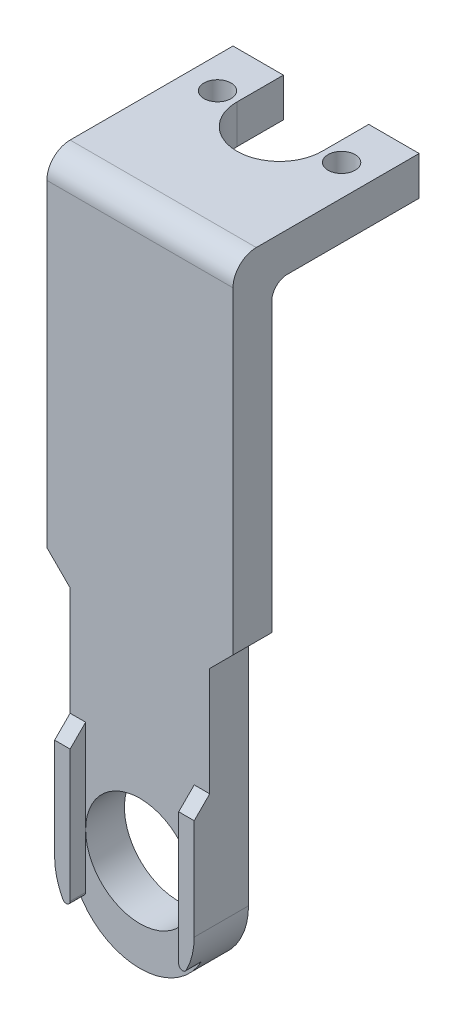
ISO-10303-21;
HEADER;
FILE_DESCRIPTION(('STEP AP214'),'2;1');
FILE_NAME('part.step','',(''),(''),'','','');
FILE_SCHEMA(('AUTOMOTIVE_DESIGN { 1 0 10303 214 1 1 1 1 }'));
ENDSEC;
DATA;
#1=APPLICATION_CONTEXT('core data for automotive mechanical design processes');
#2=APPLICATION_PROTOCOL_DEFINITION('international standard','automotive_design',2000,#1);
#3=PRODUCT_CONTEXT('',#1,'mechanical');
#4=PRODUCT('Part','Part','',(#3));
#5=PRODUCT_RELATED_PRODUCT_CATEGORY('part','',(#4));
#6=PRODUCT_DEFINITION_FORMATION('','',#4);
#7=PRODUCT_DEFINITION_CONTEXT('part definition',#1,'design');
#8=PRODUCT_DEFINITION('design','',#6,#7);
#9=PRODUCT_DEFINITION_SHAPE('','',#8);
#10=(LENGTH_UNIT() NAMED_UNIT(*) SI_UNIT(.MILLI.,.METRE.));
#11=(NAMED_UNIT(*) PLANE_ANGLE_UNIT() SI_UNIT($,.RADIAN.));
#12=(NAMED_UNIT(*) SI_UNIT($,.STERADIAN.) SOLID_ANGLE_UNIT());
#13=UNCERTAINTY_MEASURE_WITH_UNIT(LENGTH_MEASURE(1.E-05),#10,'distance_accuracy_value','');
#14=(GEOMETRIC_REPRESENTATION_CONTEXT(3) GLOBAL_UNCERTAINTY_ASSIGNED_CONTEXT((#13)) GLOBAL_UNIT_ASSIGNED_CONTEXT((#10,
#11,#12)) REPRESENTATION_CONTEXT('',''));
#15=CARTESIAN_POINT('',(0.,0.,0.));
#16=DIRECTION('',(0.,0.,1.));
#17=DIRECTION('',(1.,0.,0.));
#18=AXIS2_PLACEMENT_3D('',#15,#16,#17);
#19=CARTESIAN_POINT('',(-12.,5.,18.));
#20=DIRECTION('',(0.,0.,-1.));
#21=DIRECTION('',(-1.,0.,0.));
#22=AXIS2_PLACEMENT_3D('',#19,#20,#21);
#23=PLANE('',#22);
#24=DIRECTION('',(0.,-1.,0.));
#25=VECTOR('',#24,1.);
#26=CARTESIAN_POINT('',(7.00000000000001,-58.,18.));
#27=LINE('',#26,#25);
#28=CARTESIAN_POINT('',(7.00000000000001,-68.,18.));
#29=VERTEX_POINT('',#28);
#30=CARTESIAN_POINT('',(7.,-75.,18.));
#31=VERTEX_POINT('',#30);
#32=EDGE_CURVE('E257',#29,#31,#27,.T.);
#33=ORIENTED_EDGE('',*,*,#32,.F.);
#34=CARTESIAN_POINT('',(0.,-68.,18.));
#35=DIRECTION('',(0.,0.,1.));
#36=DIRECTION('',(1.,0.,0.));
#37=AXIS2_PLACEMENT_3D('',#34,#35,#36);
#38=CIRCLE('',#37,7.);
#39=CARTESIAN_POINT('',(-6.99999999999999,-68.,18.));
#40=VERTEX_POINT('',#39);
#41=EDGE_CURVE('E346',#40,#29,#38,.T.);
#42=ORIENTED_EDGE('',*,*,#41,.F.);
#43=DIRECTION('',(0.,1.,0.));
#44=VECTOR('',#43,1.);
#45=CARTESIAN_POINT('',(-6.99999999999999,-58.,18.));
#46=LINE('',#45,#44);
#47=CARTESIAN_POINT('',(-6.99999999999999,-75.,18.));
#48=VERTEX_POINT('',#47);
#49=EDGE_CURVE('E263',#48,#40,#46,.T.);
#50=ORIENTED_EDGE('',*,*,#49,.F.);
#51=CARTESIAN_POINT('',(-7.49999999999999,-75.,18.));
#52=DIRECTION('',(0.,0.,-1.));
#53=DIRECTION('',(-1.,0.,0.));
#54=AXIS2_PLACEMENT_3D('',#51,#52,#53);
#55=CIRCLE('',#54,0.5);
#56=CARTESIAN_POINT('',(-7.94117647058823,-75.2352941176471,18.));
#57=VERTEX_POINT('',#56);
#58=EDGE_CURVE('E11',#48,#57,#55,.T.);
#59=ORIENTED_EDGE('',*,*,#58,.T.);
#60=CARTESIAN_POINT('',(0.,-71.,18.));
#61=DIRECTION('',(0.,0.,-1.));
#62=DIRECTION('',(-1.,0.,0.));
#63=AXIS2_PLACEMENT_3D('',#60,#61,#62);
#64=CIRCLE('',#63,9.);
#65=CARTESIAN_POINT('',(0.,-80.,18.));
#66=VERTEX_POINT('',#65);
#67=EDGE_CURVE('E57',#57,#66,#64,.F.);
#68=ORIENTED_EDGE('',*,*,#67,.T.);
#69=CARTESIAN_POINT('',(0.,-71.,18.));
#70=DIRECTION('',(0.,0.,-1.));
#71=DIRECTION('',(-1.,0.,0.));
#72=AXIS2_PLACEMENT_3D('',#69,#70,#71);
#73=CIRCLE('',#72,9.);
#74=CARTESIAN_POINT('',(7.94117647058823,-75.2352941176471,18.));
#75=VERTEX_POINT('',#74);
#76=EDGE_CURVE('E456',#66,#75,#73,.F.);
#77=ORIENTED_EDGE('',*,*,#76,.T.);
#78=CARTESIAN_POINT('',(7.5,-75.,18.));
#79=DIRECTION('',(0.,0.,-1.));
#80=DIRECTION('',(-1.,0.,0.));
#81=AXIS2_PLACEMENT_3D('',#78,#79,#80);
#82=CIRCLE('',#81,0.5);
#83=EDGE_CURVE('E50',#75,#31,#82,.T.);
#84=ORIENTED_EDGE('',*,*,#83,.T.);
#85=EDGE_LOOP('',(#33,#42,#50,#59,#68,#77,#84));
#86=FACE_BOUND('',#85,.T.);
#87=ADVANCED_FACE('F41',(#86),#23,.F.);
#88=CARTESIAN_POINT('',(7.00000000000001,-56.,18.));
#89=VERTEX_POINT('',#88);
#90=EDGE_CURVE('E253',#89,#29,#27,.T.);
#91=ORIENTED_EDGE('',*,*,#90,.F.);
#92=DIRECTION('',(1.,0.,0.));
#93=VECTOR('',#92,1.);
#94=CARTESIAN_POINT('',(8.99999999999999,-56.,18.));
#95=LINE('',#94,#93);
#96=CARTESIAN_POINT('',(8.99999999999999,-56.,18.));
#97=VERTEX_POINT('',#96);
#98=EDGE_CURVE('E468',#89,#97,#95,.T.);
#99=ORIENTED_EDGE('',*,*,#98,.T.);
#100=DIRECTION('',(0.,-1.,0.));
#101=VECTOR('',#100,1.);
#102=CARTESIAN_POINT('',(8.99999999999999,-42.,18.));
#103=LINE('',#102,#101);
#104=CARTESIAN_POINT('',(8.99999999999999,-42.,18.));
#105=VERTEX_POINT('',#104);
#106=EDGE_CURVE('E292',#105,#97,#103,.T.);
#107=ORIENTED_EDGE('',*,*,#106,.F.);
#108=DIRECTION('',(-0.707106781186543,-0.707106781186552,0.));
#109=VECTOR('',#108,1.);
#110=CARTESIAN_POINT('',(12.,-39.,18.));
#111=LINE('',#110,#109);
#112=CARTESIAN_POINT('',(12.,-39.,18.));
#113=VERTEX_POINT('',#112);
#114=EDGE_CURVE('E295',#113,#105,#111,.T.);
#115=ORIENTED_EDGE('',*,*,#114,.F.);
#116=DIRECTION('',(0.,-1.,0.));
#117=VECTOR('',#116,1.);
#118=CARTESIAN_POINT('',(12.,5.,18.));
#119=LINE('',#118,#117);
#120=CARTESIAN_POINT('',(12.,2.,18.));
#121=VERTEX_POINT('',#120);
#122=EDGE_CURVE('E390',#121,#113,#119,.T.);
#123=ORIENTED_EDGE('',*,*,#122,.F.);
#124=DIRECTION('',(1.,0.,0.));
#125=VECTOR('',#124,1.);
#126=CARTESIAN_POINT('',(-12.,2.,18.));
#127=LINE('',#126,#125);
#128=CARTESIAN_POINT('',(-12.,2.,18.));
#129=VERTEX_POINT('',#128);
#130=EDGE_CURVE('E410',#121,#129,#127,.F.);
#131=ORIENTED_EDGE('',*,*,#130,.T.);
#132=DIRECTION('',(0.,-1.,0.));
#133=VECTOR('',#132,1.);
#134=CARTESIAN_POINT('',(-12.,5.,18.));
#135=LINE('',#134,#133);
#136=CARTESIAN_POINT('',(-12.,-39.,18.));
#137=VERTEX_POINT('',#136);
#138=EDGE_CURVE('E399',#129,#137,#135,.T.);
#139=ORIENTED_EDGE('',*,*,#138,.T.);
#140=DIRECTION('',(-0.707106781186544,0.707106781186551,0.));
#141=VECTOR('',#140,1.);
#142=CARTESIAN_POINT('',(-12.,-39.,18.));
#143=LINE('',#142,#141);
#144=CARTESIAN_POINT('',(-9.,-42.,18.));
#145=VERTEX_POINT('',#144);
#146=EDGE_CURVE('E279',#145,#137,#143,.T.);
#147=ORIENTED_EDGE('',*,*,#146,.F.);
#148=DIRECTION('',(0.,1.,0.));
#149=VECTOR('',#148,1.);
#150=CARTESIAN_POINT('',(-9.,-42.,18.));
#151=LINE('',#150,#149);
#152=CARTESIAN_POINT('',(-8.99999999999999,-56.,18.));
#153=VERTEX_POINT('',#152);
#154=EDGE_CURVE('E276',#153,#145,#151,.T.);
#155=ORIENTED_EDGE('',*,*,#154,.F.);
#156=DIRECTION('',(1.,0.,0.));
#157=VECTOR('',#156,1.);
#158=CARTESIAN_POINT('',(-6.99999999999999,-56.,18.));
#159=LINE('',#158,#157);
#160=CARTESIAN_POINT('',(-6.99999999999999,-56.,18.));
#161=VERTEX_POINT('',#160);
#162=EDGE_CURVE('E462',#153,#161,#159,.T.);
#163=ORIENTED_EDGE('',*,*,#162,.T.);
#164=EDGE_CURVE('E249',#40,#161,#46,.T.);
#165=ORIENTED_EDGE('',*,*,#164,.F.);
#166=EDGE_CURVE('E345',#29,#40,#38,.T.);
#167=ORIENTED_EDGE('',*,*,#166,.F.);
#168=EDGE_LOOP('',(#91,#99,#107,#115,#123,#131,#139,#147,#155,#163,#165,#167));
#169=FACE_BOUND('',#168,.T.);
#170=ADVANCED_FACE('F530',(#169),#23,.F.);
#171=CARTESIAN_POINT('',(12.,-80.,-6.));
#172=DIRECTION('',(0.,0.,1.));
#173=DIRECTION('',(1.,0.,0.));
#174=AXIS2_PLACEMENT_3D('',#171,#172,#173);
#175=PLANE('',#174);
#176=DIRECTION('',(1.,0.,0.));
#177=VECTOR('',#176,1.);
#178=CARTESIAN_POINT('',(12.,5.,-6.));
#179=LINE('',#178,#177);
#180=CARTESIAN_POINT('',(-12.,5.,-6.));
#181=VERTEX_POINT('',#180);
#182=CARTESIAN_POINT('',(-5.5,5.,-6.));
#183=VERTEX_POINT('',#182);
#184=EDGE_CURVE('E329',#181,#183,#179,.T.);
#185=ORIENTED_EDGE('',*,*,#184,.T.);
#186=DIRECTION('',(0.,-1.,0.));
#187=VECTOR('',#186,1.);
#188=CARTESIAN_POINT('',(-5.5,-80.,-6.));
#189=LINE('',#188,#187);
#190=CARTESIAN_POINT('',(-5.5,0.,-6.));
#191=VERTEX_POINT('',#190);
#192=EDGE_CURVE('E439',#183,#191,#189,.T.);
#193=ORIENTED_EDGE('',*,*,#192,.T.);
#194=DIRECTION('',(-1.,0.,0.));
#195=VECTOR('',#194,1.);
#196=CARTESIAN_POINT('',(0.,0.,-6.));
#197=LINE('',#196,#195);
#198=CARTESIAN_POINT('',(-12.,0.,-6.));
#199=VERTEX_POINT('',#198);
#200=EDGE_CURVE('E338',#191,#199,#197,.T.);
#201=ORIENTED_EDGE('',*,*,#200,.T.);
#202=DIRECTION('',(0.,1.,0.));
#203=VECTOR('',#202,1.);
#204=CARTESIAN_POINT('',(-12.,-80.,-6.));
#205=LINE('',#204,#203);
#206=EDGE_CURVE('E333',#199,#181,#205,.T.);
#207=ORIENTED_EDGE('',*,*,#206,.T.);
#208=EDGE_LOOP('',(#185,#193,#201,#207));
#209=FACE_BOUND('',#208,.T.);
#210=ADVANCED_FACE('F595',(#209),#175,.F.);
#211=CARTESIAN_POINT('',(0.,5.,0.));
#212=DIRECTION('',(0.,-1.,0.));
#213=DIRECTION('',(0.,0.,-1.));
#214=AXIS2_PLACEMENT_3D('',#211,#212,#213);
#215=PLANE('',#214);
#216=CARTESIAN_POINT('',(0.,5.,0.));
#217=DIRECTION('',(0.,1.,0.));
#218=DIRECTION('',(0.,0.,1.));
#219=AXIS2_PLACEMENT_3D('',#216,#217,#218);
#220=CIRCLE('',#219,5.5);
#221=CARTESIAN_POINT('',(-5.5,5.,0.));
#222=VERTEX_POINT('',#221);
#223=CARTESIAN_POINT('',(5.5,5.,0.));
#224=VERTEX_POINT('',#223);
#225=EDGE_CURVE('E374',#222,#224,#220,.T.);
#226=ORIENTED_EDGE('',*,*,#225,.F.);
#227=DIRECTION('',(0.,0.,1.));
#228=VECTOR('',#227,1.);
#229=CARTESIAN_POINT('',(-5.5,5.,-6.));
#230=LINE('',#229,#228);
#231=EDGE_CURVE('E309',#183,#222,#230,.T.);
#232=ORIENTED_EDGE('',*,*,#231,.F.);
#233=ORIENTED_EDGE('',*,*,#184,.F.);
#234=DIRECTION('',(0.,0.,1.));
#235=VECTOR('',#234,1.);
#236=CARTESIAN_POINT('',(-12.,5.,-8.));
#237=LINE('',#236,#235);
#238=CARTESIAN_POINT('',(-12.,5.,15.));
#239=VERTEX_POINT('',#238);
#240=EDGE_CURVE('E382',#181,#239,#237,.T.);
#241=ORIENTED_EDGE('',*,*,#240,.T.);
#242=DIRECTION('',(1.,0.,0.));
#243=VECTOR('',#242,1.);
#244=CARTESIAN_POINT('',(0.,5.,15.));
#245=LINE('',#244,#243);
#246=CARTESIAN_POINT('',(12.,5.,15.));
#247=VERTEX_POINT('',#246);
#248=EDGE_CURVE('E403',#239,#247,#245,.T.);
#249=ORIENTED_EDGE('',*,*,#248,.T.);
#250=DIRECTION('',(0.,0.,-1.));
#251=VECTOR('',#250,1.);
#252=CARTESIAN_POINT('',(12.,5.,18.));
#253=LINE('',#252,#251);
#254=CARTESIAN_POINT('',(12.,5.,-5.99999999999999));
#255=VERTEX_POINT('',#254);
#256=EDGE_CURVE('E385',#247,#255,#253,.T.);
#257=ORIENTED_EDGE('',*,*,#256,.T.);
#258=CARTESIAN_POINT('',(5.5,5.,-6.));
#259=VERTEX_POINT('',#258);
#260=EDGE_CURVE('E328',#259,#255,#179,.T.);
#261=ORIENTED_EDGE('',*,*,#260,.F.);
#262=DIRECTION('',(0.,0.,-1.));
#263=VECTOR('',#262,1.);
#264=CARTESIAN_POINT('',(5.5,5.,0.));
#265=LINE('',#264,#263);
#266=EDGE_CURVE('E312',#224,#259,#265,.T.);
#267=ORIENTED_EDGE('',*,*,#266,.F.);
#268=EDGE_LOOP('',(#226,#232,#233,#241,#249,#257,#261,#267));
#269=FACE_BOUND('',#268,.T.);
#270=CARTESIAN_POINT('',(-8.,5.,0.));
#271=DIRECTION('',(0.,1.,0.));
#272=DIRECTION('',(0.,0.,1.));
#273=AXIS2_PLACEMENT_3D('',#270,#271,#272);
#274=CIRCLE('',#273,1.75);
#275=CARTESIAN_POINT('',(-8.,5.,1.75));
#276=VERTEX_POINT('',#275);
#277=EDGE_CURVE('E366',#276,#276,#274,.T.);
#278=ORIENTED_EDGE('',*,*,#277,.F.);
#279=EDGE_LOOP('',(#278));
#280=FACE_BOUND('',#279,.T.);
#281=CARTESIAN_POINT('',(8.,5.,0.));
#282=DIRECTION('',(0.,1.,0.));
#283=DIRECTION('',(0.,0.,1.));
#284=AXIS2_PLACEMENT_3D('',#281,#282,#283);
#285=CIRCLE('',#284,1.75);
#286=CARTESIAN_POINT('',(8.,5.,1.75));
#287=VERTEX_POINT('',#286);
#288=EDGE_CURVE('E358',#287,#287,#285,.T.);
#289=ORIENTED_EDGE('',*,*,#288,.F.);
#290=EDGE_LOOP('',(#289));
#291=FACE_BOUND('',#290,.T.);
#292=ADVANCED_FACE('F546',(#269,#280,#291),#215,.F.);
#293=CARTESIAN_POINT('',(0.,0.,0.));
#294=DIRECTION('',(0.,-1.,0.));
#295=DIRECTION('',(0.,0.,-1.));
#296=AXIS2_PLACEMENT_3D('',#293,#294,#295);
#297=PLANE('',#296);
#298=DIRECTION('',(0.,0.,-1.));
#299=VECTOR('',#298,1.);
#300=CARTESIAN_POINT('',(-5.5,0.,0.));
#301=LINE('',#300,#299);
#302=CARTESIAN_POINT('',(-5.5,0.,0.));
#303=VERTEX_POINT('',#302);
#304=EDGE_CURVE('E325',#303,#191,#301,.T.);
#305=ORIENTED_EDGE('',*,*,#304,.F.);
#306=CARTESIAN_POINT('',(0.,0.,0.));
#307=DIRECTION('',(0.,1.,0.));
#308=DIRECTION('',(0.,0.,1.));
#309=AXIS2_PLACEMENT_3D('',#306,#307,#308);
#310=CIRCLE('',#309,5.5);
#311=CARTESIAN_POINT('',(5.5,0.,0.));
#312=VERTEX_POINT('',#311);
#313=EDGE_CURVE('E370',#303,#312,#310,.T.);
#314=ORIENTED_EDGE('',*,*,#313,.T.);
#315=DIRECTION('',(0.,0.,1.));
#316=VECTOR('',#315,1.);
#317=CARTESIAN_POINT('',(5.5,0.,0.));
#318=LINE('',#317,#316);
#319=CARTESIAN_POINT('',(5.5,0.,-6.));
#320=VERTEX_POINT('',#319);
#321=EDGE_CURVE('E319',#320,#312,#318,.T.);
#322=ORIENTED_EDGE('',*,*,#321,.F.);
#323=CARTESIAN_POINT('',(12.,0.,-6.));
#324=VERTEX_POINT('',#323);
#325=EDGE_CURVE('E341',#324,#320,#197,.T.);
#326=ORIENTED_EDGE('',*,*,#325,.F.);
#327=DIRECTION('',(0.,0.,-1.));
#328=VECTOR('',#327,1.);
#329=CARTESIAN_POINT('',(12.,0.,-8.));
#330=LINE('',#329,#328);
#331=CARTESIAN_POINT('',(12.,0.,11.));
#332=VERTEX_POINT('',#331);
#333=EDGE_CURVE('E386',#332,#324,#330,.T.);
#334=ORIENTED_EDGE('',*,*,#333,.F.);
#335=DIRECTION('',(1.,0.,0.));
#336=VECTOR('',#335,1.);
#337=CARTESIAN_POINT('',(0.,0.,11.));
#338=LINE('',#337,#336);
#339=CARTESIAN_POINT('',(-12.,0.,11.));
#340=VERTEX_POINT('',#339);
#341=EDGE_CURVE('E421',#332,#340,#338,.F.);
#342=ORIENTED_EDGE('',*,*,#341,.T.);
#343=DIRECTION('',(0.,0.,1.));
#344=VECTOR('',#343,1.);
#345=CARTESIAN_POINT('',(-12.,0.,-8.));
#346=LINE('',#345,#344);
#347=EDGE_CURVE('E378',#199,#340,#346,.T.);
#348=ORIENTED_EDGE('',*,*,#347,.F.);
#349=ORIENTED_EDGE('',*,*,#200,.F.);
#350=EDGE_LOOP('',(#305,#314,#322,#326,#334,#342,#348,#349));
#351=FACE_BOUND('',#350,.T.);
#352=CARTESIAN_POINT('',(-8.,0.,0.));
#353=DIRECTION('',(0.,1.,0.));
#354=DIRECTION('',(0.,0.,1.));
#355=AXIS2_PLACEMENT_3D('',#352,#353,#354);
#356=CIRCLE('',#355,1.75);
#357=CARTESIAN_POINT('',(-8.,0.,1.75));
#358=VERTEX_POINT('',#357);
#359=EDGE_CURVE('E362',#358,#358,#356,.T.);
#360=ORIENTED_EDGE('',*,*,#359,.T.);
#361=EDGE_LOOP('',(#360));
#362=FACE_BOUND('',#361,.T.);
#363=CARTESIAN_POINT('',(8.,0.,0.));
#364=DIRECTION('',(0.,1.,0.));
#365=DIRECTION('',(0.,0.,1.));
#366=AXIS2_PLACEMENT_3D('',#363,#364,#365);
#367=CIRCLE('',#366,1.75);
#368=CARTESIAN_POINT('',(8.,0.,1.75));
#369=VERTEX_POINT('',#368);
#370=EDGE_CURVE('E357',#369,#369,#367,.T.);
#371=ORIENTED_EDGE('',*,*,#370,.T.);
#372=EDGE_LOOP('',(#371));
#373=FACE_BOUND('',#372,.T.);
#374=ADVANCED_FACE('F559',(#351,#362,#373),#297,.T.);
#375=CARTESIAN_POINT('',(-12.,5.,-8.));
#376=DIRECTION('',(1.,0.,0.));
#377=DIRECTION('',(0.,0.,-1.));
#378=AXIS2_PLACEMENT_3D('',#375,#376,#377);
#379=PLANE('',#378);
#380=DIRECTION('',(0.,1.,0.));
#381=VECTOR('',#380,1.);
#382=CARTESIAN_POINT('',(-12.,-80.,13.));
#383=LINE('',#382,#381);
#384=CARTESIAN_POINT('',(-12.,-39.,13.));
#385=VERTEX_POINT('',#384);
#386=CARTESIAN_POINT('',(-12.,-2.,13.));
#387=VERTEX_POINT('',#386);
#388=EDGE_CURVE('E354',#385,#387,#383,.T.);
#389=ORIENTED_EDGE('',*,*,#388,.F.);
#390=DIRECTION('',(0.,0.,1.));
#391=VECTOR('',#390,1.);
#392=CARTESIAN_POINT('',(-12.,-39.,-6.));
#393=LINE('',#392,#391);
#394=EDGE_CURVE('E284',#385,#137,#393,.T.);
#395=ORIENTED_EDGE('',*,*,#394,.T.);
#396=ORIENTED_EDGE('',*,*,#138,.F.);
#397=CARTESIAN_POINT('',(-12.,2.,15.));
#398=DIRECTION('',(1.,0.,0.));
#399=DIRECTION('',(0.,0.,-1.));
#400=AXIS2_PLACEMENT_3D('',#397,#398,#399);
#401=CIRCLE('',#400,3.);
#402=EDGE_CURVE('E413',#129,#239,#401,.F.);
#403=ORIENTED_EDGE('',*,*,#402,.T.);
#404=ORIENTED_EDGE('',*,*,#240,.F.);
#405=ORIENTED_EDGE('',*,*,#206,.F.);
#406=ORIENTED_EDGE('',*,*,#347,.T.);
#407=CARTESIAN_POINT('',(-12.,-2.,11.));
#408=DIRECTION('',(1.,0.,0.));
#409=DIRECTION('',(0.,0.,-1.));
#410=AXIS2_PLACEMENT_3D('',#407,#408,#409);
#411=CIRCLE('',#410,2.);
#412=EDGE_CURVE('E428',#340,#387,#411,.T.);
#413=ORIENTED_EDGE('',*,*,#412,.T.);
#414=EDGE_LOOP('',(#389,#395,#396,#403,#404,#405,#406,#413));
#415=FACE_BOUND('',#414,.T.);
#416=ADVANCED_FACE('F538',(#415),#379,.F.);
#417=CARTESIAN_POINT('',(12.,5.,-8.));
#418=DIRECTION('',(-1.,0.,0.));
#419=DIRECTION('',(0.,0.,1.));
#420=AXIS2_PLACEMENT_3D('',#417,#418,#419);
#421=PLANE('',#420);
#422=ORIENTED_EDGE('',*,*,#122,.T.);
#423=DIRECTION('',(0.,0.,1.));
#424=VECTOR('',#423,1.);
#425=CARTESIAN_POINT('',(12.,-39.,-6.));
#426=LINE('',#425,#424);
#427=CARTESIAN_POINT('',(12.,-39.,13.));
#428=VERTEX_POINT('',#427);
#429=EDGE_CURVE('E299',#428,#113,#426,.T.);
#430=ORIENTED_EDGE('',*,*,#429,.F.);
#431=DIRECTION('',(0.,1.,0.));
#432=VECTOR('',#431,1.);
#433=CARTESIAN_POINT('',(12.,-80.,13.));
#434=LINE('',#433,#432);
#435=CARTESIAN_POINT('',(12.,-2.,13.));
#436=VERTEX_POINT('',#435);
#437=EDGE_CURVE('E351',#428,#436,#434,.T.);
#438=ORIENTED_EDGE('',*,*,#437,.T.);
#439=CARTESIAN_POINT('',(12.,-2.,11.));
#440=DIRECTION('',(-1.,0.,0.));
#441=DIRECTION('',(0.,0.,1.));
#442=AXIS2_PLACEMENT_3D('',#439,#440,#441);
#443=CIRCLE('',#442,2.);
#444=EDGE_CURVE('E425',#436,#332,#443,.T.);
#445=ORIENTED_EDGE('',*,*,#444,.T.);
#446=ORIENTED_EDGE('',*,*,#333,.T.);
#447=DIRECTION('',(0.,1.,0.));
#448=VECTOR('',#447,1.);
#449=CARTESIAN_POINT('',(12.,-80.,-6.));
#450=LINE('',#449,#448);
#451=EDGE_CURVE('E334',#324,#255,#450,.T.);
#452=ORIENTED_EDGE('',*,*,#451,.T.);
#453=ORIENTED_EDGE('',*,*,#256,.F.);
#454=CARTESIAN_POINT('',(12.,2.,15.));
#455=DIRECTION('',(-1.,0.,0.));
#456=DIRECTION('',(0.,0.,1.));
#457=AXIS2_PLACEMENT_3D('',#454,#455,#456);
#458=CIRCLE('',#457,3.);
#459=EDGE_CURVE('E407',#247,#121,#458,.F.);
#460=ORIENTED_EDGE('',*,*,#459,.T.);
#461=EDGE_LOOP('',(#422,#430,#438,#445,#446,#452,#453,#460));
#462=FACE_BOUND('',#461,.T.);
#463=ADVANCED_FACE('F551',(#462),#421,.F.);
#464=CARTESIAN_POINT('',(0.,5.,0.));
#465=DIRECTION('',(0.,-1.,0.));
#466=DIRECTION('',(0.,0.,-1.));
#467=AXIS2_PLACEMENT_3D('',#464,#465,#466);
#468=CYLINDRICAL_SURFACE('',#467,5.5);
#469=DIRECTION('',(0.,1.,0.));
#470=VECTOR('',#469,1.);
#471=CARTESIAN_POINT('',(-5.5,-80.,0.));
#472=LINE('',#471,#470);
#473=EDGE_CURVE('E315',#303,#222,#472,.T.);
#474=ORIENTED_EDGE('',*,*,#473,.T.);
#475=ORIENTED_EDGE('',*,*,#225,.T.);
#476=DIRECTION('',(0.,1.,0.));
#477=VECTOR('',#476,1.);
#478=CARTESIAN_POINT('',(5.5,-80.,0.));
#479=LINE('',#478,#477);
#480=EDGE_CURVE('E316',#312,#224,#479,.T.);
#481=ORIENTED_EDGE('',*,*,#480,.F.);
#482=ORIENTED_EDGE('',*,*,#313,.F.);
#483=EDGE_LOOP('',(#474,#475,#481,#482));
#484=FACE_BOUND('',#483,.T.);
#485=ADVANCED_FACE('F568',(#484),#468,.F.);
#486=CARTESIAN_POINT('',(-8.,5.,0.));
#487=DIRECTION('',(0.,-1.,0.));
#488=DIRECTION('',(0.,0.,-1.));
#489=AXIS2_PLACEMENT_3D('',#486,#487,#488);
#490=CYLINDRICAL_SURFACE('',#489,1.75);
#491=ORIENTED_EDGE('',*,*,#277,.T.);
#492=EDGE_LOOP('',(#491));
#493=FACE_BOUND('',#492,.T.);
#494=ORIENTED_EDGE('',*,*,#359,.F.);
#495=EDGE_LOOP('',(#494));
#496=FACE_BOUND('',#495,.T.);
#497=ADVANCED_FACE('F670',(#493,#496),#490,.F.);
#498=CARTESIAN_POINT('',(8.,5.,0.));
#499=DIRECTION('',(0.,-1.,0.));
#500=DIRECTION('',(0.,0.,-1.));
#501=AXIS2_PLACEMENT_3D('',#498,#499,#500);
#502=CYLINDRICAL_SURFACE('',#501,1.75);
#503=ORIENTED_EDGE('',*,*,#288,.T.);
#504=EDGE_LOOP('',(#503));
#505=FACE_BOUND('',#504,.T.);
#506=ORIENTED_EDGE('',*,*,#370,.F.);
#507=EDGE_LOOP('',(#506));
#508=FACE_BOUND('',#507,.T.);
#509=ADVANCED_FACE('F666',(#505,#508),#502,.F.);
#510=CARTESIAN_POINT('',(-12.,-80.,13.));
#511=DIRECTION('',(0.,0.,1.));
#512=DIRECTION('',(1.,0.,0.));
#513=AXIS2_PLACEMENT_3D('',#510,#511,#512);
#514=PLANE('',#513);
#515=CARTESIAN_POINT('',(0.,-68.,13.));
#516=DIRECTION('',(0.,0.,1.));
#517=DIRECTION('',(1.,0.,0.));
#518=AXIS2_PLACEMENT_3D('',#515,#516,#517);
#519=CIRCLE('',#518,7.);
#520=CARTESIAN_POINT('',(7.00000000000001,-68.,13.));
#521=VERTEX_POINT('',#520);
#522=EDGE_CURVE('E350',#521,#521,#519,.T.);
#523=ORIENTED_EDGE('',*,*,#522,.T.);
#524=EDGE_LOOP('',(#523));
#525=FACE_BOUND('',#524,.T.);
#526=DIRECTION('',(0.,-1.,0.));
#527=VECTOR('',#526,1.);
#528=CARTESIAN_POINT('',(8.99999999999998,-80.,13.));
#529=LINE('',#528,#527);
#530=CARTESIAN_POINT('',(8.99999999999999,-42.,13.));
#531=VERTEX_POINT('',#530);
#532=CARTESIAN_POINT('',(8.99999999999998,-71.,13.));
#533=VERTEX_POINT('',#532);
#534=EDGE_CURVE('E288',#531,#533,#529,.T.);
#535=ORIENTED_EDGE('',*,*,#534,.T.);
#536=CARTESIAN_POINT('',(0.,-71.,13.));
#537=DIRECTION('',(0.,0.,1.));
#538=DIRECTION('',(1.,0.,0.));
#539=AXIS2_PLACEMENT_3D('',#536,#537,#538);
#540=CIRCLE('',#539,9.);
#541=CARTESIAN_POINT('',(0.,-80.,13.));
#542=VERTEX_POINT('',#541);
#543=EDGE_CURVE('E234',#533,#542,#540,.F.);
#544=ORIENTED_EDGE('',*,*,#543,.T.);
#545=CARTESIAN_POINT('',(0.,-71.,13.));
#546=DIRECTION('',(0.,0.,1.));
#547=DIRECTION('',(1.,0.,0.));
#548=AXIS2_PLACEMENT_3D('',#545,#546,#547);
#549=CIRCLE('',#548,9.);
#550=CARTESIAN_POINT('',(-8.99999999999999,-71.,13.));
#551=VERTEX_POINT('',#550);
#552=EDGE_CURVE('E238',#542,#551,#549,.F.);
#553=ORIENTED_EDGE('',*,*,#552,.T.);
#554=DIRECTION('',(0.,1.,0.));
#555=VECTOR('',#554,1.);
#556=CARTESIAN_POINT('',(-8.99999999999998,-80.,13.));
#557=LINE('',#556,#555);
#558=CARTESIAN_POINT('',(-9.,-42.,13.));
#559=VERTEX_POINT('',#558);
#560=EDGE_CURVE('E306',#551,#559,#557,.T.);
#561=ORIENTED_EDGE('',*,*,#560,.T.);
#562=DIRECTION('',(-0.707106781186544,0.707106781186551,0.));
#563=VECTOR('',#562,1.);
#564=CARTESIAN_POINT('',(8.5,-59.5000000000002,13.));
#565=LINE('',#564,#563);
#566=EDGE_CURVE('E239',#559,#385,#565,.T.);
#567=ORIENTED_EDGE('',*,*,#566,.T.);
#568=ORIENTED_EDGE('',*,*,#388,.T.);
#569=DIRECTION('',(1.,0.,0.));
#570=VECTOR('',#569,1.);
#571=CARTESIAN_POINT('',(-12.,-2.,13.));
#572=LINE('',#571,#570);
#573=EDGE_CURVE('E417',#387,#436,#572,.T.);
#574=ORIENTED_EDGE('',*,*,#573,.T.);
#575=ORIENTED_EDGE('',*,*,#437,.F.);
#576=DIRECTION('',(-0.707106781186543,-0.707106781186552,0.));
#577=VECTOR('',#576,1.);
#578=CARTESIAN_POINT('',(-20.4999999999999,-71.5000000000002,13.));
#579=LINE('',#578,#577);
#580=EDGE_CURVE('E443',#428,#531,#579,.T.);
#581=ORIENTED_EDGE('',*,*,#580,.T.);
#582=EDGE_LOOP('',(#535,#544,#553,#561,#567,#568,#574,#575,#581));
#583=FACE_BOUND('',#582,.T.);
#584=ADVANCED_FACE('F519',(#525,#583),#514,.F.);
#585=CARTESIAN_POINT('',(0.,2.,15.));
#586=DIRECTION('',(1.,0.,0.));
#587=DIRECTION('',(0.,0.,-1.));
#588=AXIS2_PLACEMENT_3D('',#585,#586,#587);
#589=CYLINDRICAL_SURFACE('',#588,3.);
#590=ORIENTED_EDGE('',*,*,#402,.F.);
#591=ORIENTED_EDGE('',*,*,#130,.F.);
#592=ORIENTED_EDGE('',*,*,#459,.F.);
#593=ORIENTED_EDGE('',*,*,#248,.F.);
#594=EDGE_LOOP('',(#590,#591,#592,#593));
#595=FACE_BOUND('',#594,.T.);
#596=ADVANCED_FACE('F542',(#595),#589,.T.);
#597=CARTESIAN_POINT('',(-12.,-2.,11.));
#598=DIRECTION('',(1.,0.,0.));
#599=DIRECTION('',(0.,0.,-1.));
#600=AXIS2_PLACEMENT_3D('',#597,#598,#599);
#601=CYLINDRICAL_SURFACE('',#600,2.);
#602=ORIENTED_EDGE('',*,*,#412,.F.);
#603=ORIENTED_EDGE('',*,*,#341,.F.);
#604=ORIENTED_EDGE('',*,*,#444,.F.);
#605=ORIENTED_EDGE('',*,*,#573,.F.);
#606=EDGE_LOOP('',(#602,#603,#604,#605));
#607=FACE_BOUND('',#606,.T.);
#608=ADVANCED_FACE('F601',(#607),#601,.F.);
#609=CARTESIAN_POINT('',(0.,-68.,-42.));
#610=DIRECTION('',(0.,0.,1.));
#611=DIRECTION('',(1.,0.,0.));
#612=AXIS2_PLACEMENT_3D('',#609,#610,#611);
#613=CYLINDRICAL_SURFACE('',#612,7.);
#614=ORIENTED_EDGE('',*,*,#41,.T.);
#615=ORIENTED_EDGE('',*,*,#166,.T.);
#616=EDGE_LOOP('',(#614,#615));
#617=FACE_BOUND('',#616,.T.);
#618=ORIENTED_EDGE('',*,*,#522,.F.);
#619=EDGE_LOOP('',(#618));
#620=FACE_BOUND('',#619,.T.);
#621=ADVANCED_FACE('F588',(#617,#620),#613,.F.);
#622=ORIENTED_EDGE('',*,*,#325,.T.);
#623=DIRECTION('',(0.,1.,0.));
#624=VECTOR('',#623,1.);
#625=CARTESIAN_POINT('',(5.5,-80.,-6.));
#626=LINE('',#625,#624);
#627=EDGE_CURVE('E432',#320,#259,#626,.T.);
#628=ORIENTED_EDGE('',*,*,#627,.T.);
#629=ORIENTED_EDGE('',*,*,#260,.T.);
#630=ORIENTED_EDGE('',*,*,#451,.F.);
#631=EDGE_LOOP('',(#622,#628,#629,#630));
#632=FACE_BOUND('',#631,.T.);
#633=ADVANCED_FACE('F555',(#632),#175,.F.);
#634=CARTESIAN_POINT('',(5.5,-80.,0.));
#635=DIRECTION('',(1.,0.,0.));
#636=DIRECTION('',(0.,0.,-1.));
#637=AXIS2_PLACEMENT_3D('',#634,#635,#636);
#638=PLANE('',#637);
#639=ORIENTED_EDGE('',*,*,#321,.T.);
#640=ORIENTED_EDGE('',*,*,#480,.T.);
#641=ORIENTED_EDGE('',*,*,#266,.T.);
#642=ORIENTED_EDGE('',*,*,#627,.F.);
#643=EDGE_LOOP('',(#639,#640,#641,#642));
#644=FACE_BOUND('',#643,.T.);
#645=ADVANCED_FACE('F565',(#644),#638,.F.);
#646=CARTESIAN_POINT('',(-5.5,-80.,-6.));
#647=DIRECTION('',(-1.,0.,0.));
#648=DIRECTION('',(0.,0.,1.));
#649=AXIS2_PLACEMENT_3D('',#646,#647,#648);
#650=PLANE('',#649);
#651=ORIENTED_EDGE('',*,*,#304,.T.);
#652=ORIENTED_EDGE('',*,*,#192,.F.);
#653=ORIENTED_EDGE('',*,*,#231,.T.);
#654=ORIENTED_EDGE('',*,*,#473,.F.);
#655=EDGE_LOOP('',(#651,#652,#653,#654));
#656=FACE_BOUND('',#655,.T.);
#657=ADVANCED_FACE('F652',(#656),#650,.F.);
#658=CARTESIAN_POINT('',(12.,-39.,-6.));
#659=DIRECTION('',(-0.707106781186552,0.707106781186543,0.));
#660=DIRECTION('',(-0.707106781186543,-0.707106781186552,0.));
#661=AXIS2_PLACEMENT_3D('',#658,#659,#660);
#662=PLANE('',#661);
#663=ORIENTED_EDGE('',*,*,#429,.T.);
#664=ORIENTED_EDGE('',*,*,#114,.T.);
#665=DIRECTION('',(0.,0.,1.));
#666=VECTOR('',#665,1.);
#667=CARTESIAN_POINT('',(8.99999999999999,-42.,-6.));
#668=LINE('',#667,#666);
#669=EDGE_CURVE('E280',#531,#105,#668,.T.);
#670=ORIENTED_EDGE('',*,*,#669,.F.);
#671=ORIENTED_EDGE('',*,*,#580,.F.);
#672=EDGE_LOOP('',(#663,#664,#670,#671));
#673=FACE_BOUND('',#672,.T.);
#674=ADVANCED_FACE('F606',(#673),#662,.F.);
#675=CARTESIAN_POINT('',(8.99999999999999,-42.,-6.));
#676=DIRECTION('',(-1.,0.,0.));
#677=DIRECTION('',(0.,-1.,0.));
#678=AXIS2_PLACEMENT_3D('',#675,#676,#677);
#679=PLANE('',#678);
#680=ORIENTED_EDGE('',*,*,#106,.T.);
#681=DIRECTION('',(0.,0.707106781186546,-0.707106781186549));
#682=VECTOR('',#681,1.);
#683=CARTESIAN_POINT('',(8.99999999999999,-37.0000000000001,-1.00000000000005));
#684=LINE('',#683,#682);
#685=CARTESIAN_POINT('',(9.00000000000001,-58.,20.));
#686=VERTEX_POINT('',#685);
#687=EDGE_CURVE('E244',#97,#686,#684,.F.);
#688=ORIENTED_EDGE('',*,*,#687,.T.);
#689=DIRECTION('',(0.,1.,0.));
#690=VECTOR('',#689,1.);
#691=CARTESIAN_POINT('',(9.00000000000001,-58.,20.));
#692=LINE('',#691,#690);
#693=CARTESIAN_POINT('',(9.,-71.,20.));
#694=VERTEX_POINT('',#693);
#695=EDGE_CURVE('E220',#694,#686,#692,.T.);
#696=ORIENTED_EDGE('',*,*,#695,.F.);
#697=DIRECTION('',(0.,0.,-1.));
#698=VECTOR('',#697,1.);
#699=CARTESIAN_POINT('',(8.99999999999998,-71.,13.));
#700=LINE('',#699,#698);
#701=EDGE_CURVE('E231',#694,#533,#700,.T.);
#702=ORIENTED_EDGE('',*,*,#701,.T.);
#703=ORIENTED_EDGE('',*,*,#534,.F.);
#704=ORIENTED_EDGE('',*,*,#669,.T.);
#705=EDGE_LOOP('',(#680,#688,#696,#702,#703,#704));
#706=FACE_BOUND('',#705,.T.);
#707=ADVANCED_FACE('F242',(#706),#679,.F.);
#708=CARTESIAN_POINT('',(-12.,-39.,-6.));
#709=DIRECTION('',(0.707106781186551,0.707106781186544,0.));
#710=DIRECTION('',(-0.707106781186544,0.707106781186551,0.));
#711=AXIS2_PLACEMENT_3D('',#708,#709,#710);
#712=PLANE('',#711);
#713=DIRECTION('',(0.,0.,1.));
#714=VECTOR('',#713,1.);
#715=CARTESIAN_POINT('',(-9.,-42.,-6.));
#716=LINE('',#715,#714);
#717=EDGE_CURVE('E283',#559,#145,#716,.T.);
#718=ORIENTED_EDGE('',*,*,#717,.T.);
#719=ORIENTED_EDGE('',*,*,#146,.T.);
#720=ORIENTED_EDGE('',*,*,#394,.F.);
#721=ORIENTED_EDGE('',*,*,#566,.F.);
#722=EDGE_LOOP('',(#718,#719,#720,#721));
#723=FACE_BOUND('',#722,.T.);
#724=ADVANCED_FACE('F528',(#723),#712,.F.);
#725=CARTESIAN_POINT('',(-9.,-42.,-6.));
#726=DIRECTION('',(1.,0.,0.));
#727=DIRECTION('',(0.,1.,0.));
#728=AXIS2_PLACEMENT_3D('',#725,#726,#727);
#729=PLANE('',#728);
#730=ORIENTED_EDGE('',*,*,#560,.F.);
#731=DIRECTION('',(0.,0.,1.));
#732=VECTOR('',#731,1.);
#733=CARTESIAN_POINT('',(-8.99999999999999,-71.,18.));
#734=LINE('',#733,#732);
#735=CARTESIAN_POINT('',(-8.99999999999999,-71.,20.));
#736=VERTEX_POINT('',#735);
#737=EDGE_CURVE('E459',#551,#736,#734,.T.);
#738=ORIENTED_EDGE('',*,*,#737,.T.);
#739=DIRECTION('',(0.,-1.,0.));
#740=VECTOR('',#739,1.);
#741=CARTESIAN_POINT('',(-8.99999999999999,-58.,20.));
#742=LINE('',#741,#740);
#743=CARTESIAN_POINT('',(-8.99999999999999,-58.,20.));
#744=VERTEX_POINT('',#743);
#745=EDGE_CURVE('E262',#744,#736,#742,.T.);
#746=ORIENTED_EDGE('',*,*,#745,.F.);
#747=DIRECTION('',(0.,-0.707106781186546,0.707106781186549));
#748=VECTOR('',#747,1.);
#749=CARTESIAN_POINT('',(-9.,-37.0000000000001,-1.00000000000006));
#750=LINE('',#749,#748);
#751=EDGE_CURVE('E477',#744,#153,#750,.F.);
#752=ORIENTED_EDGE('',*,*,#751,.T.);
#753=ORIENTED_EDGE('',*,*,#154,.T.);
#754=ORIENTED_EDGE('',*,*,#717,.F.);
#755=EDGE_LOOP('',(#730,#738,#746,#752,#753,#754));
#756=FACE_BOUND('',#755,.T.);
#757=ADVANCED_FACE('F523',(#756),#729,.F.);
#758=CARTESIAN_POINT('',(0.,-71.,-6.));
#759=DIRECTION('',(0.,0.,-1.));
#760=DIRECTION('',(-1.,0.,0.));
#761=AXIS2_PLACEMENT_3D('',#758,#759,#760);
#762=CYLINDRICAL_SURFACE('',#761,9.);
#763=ORIENTED_EDGE('',*,*,#67,.F.);
#764=DIRECTION('',(0.,0.,-1.));
#765=VECTOR('',#764,1.);
#766=CARTESIAN_POINT('',(-7.94117647058823,-75.2352941176471,-6.));
#767=LINE('',#766,#765);
#768=CARTESIAN_POINT('',(-7.94117647058823,-75.2352941176471,20.));
#769=VERTEX_POINT('',#768);
#770=EDGE_CURVE('E61',#57,#769,#767,.F.);
#771=ORIENTED_EDGE('',*,*,#770,.T.);
#772=CARTESIAN_POINT('',(0.,-71.,20.));
#773=DIRECTION('',(0.,0.,1.));
#774=DIRECTION('',(1.,0.,0.));
#775=AXIS2_PLACEMENT_3D('',#772,#773,#774);
#776=CIRCLE('',#775,9.);
#777=EDGE_CURVE('E267',#736,#769,#776,.T.);
#778=ORIENTED_EDGE('',*,*,#777,.F.);
#779=ORIENTED_EDGE('',*,*,#737,.F.);
#780=ORIENTED_EDGE('',*,*,#552,.F.);
#781=DIRECTION('',(0.,0.,1.));
#782=VECTOR('',#781,1.);
#783=CARTESIAN_POINT('',(0.,-80.,13.));
#784=LINE('',#783,#782);
#785=EDGE_CURVE('E273',#66,#542,#784,.F.);
#786=ORIENTED_EDGE('',*,*,#785,.F.);
#787=EDGE_LOOP('',(#763,#771,#778,#779,#780,#786));
#788=FACE_BOUND('',#787,.T.);
#789=ADVANCED_FACE('F515',(#788),#762,.T.);
#790=CARTESIAN_POINT('',(0.,-71.,-6.));
#791=DIRECTION('',(0.,0.,1.));
#792=DIRECTION('',(1.,0.,0.));
#793=AXIS2_PLACEMENT_3D('',#790,#791,#792);
#794=CYLINDRICAL_SURFACE('',#793,9.);
#795=CARTESIAN_POINT('',(0.,-71.,20.));
#796=DIRECTION('',(0.,0.,1.));
#797=DIRECTION('',(-1.,0.,0.));
#798=AXIS2_PLACEMENT_3D('',#795,#796,#797);
#799=CIRCLE('',#798,8.99999999999999);
#800=CARTESIAN_POINT('',(7.94117647058824,-75.2352941176471,20.));
#801=VERTEX_POINT('',#800);
#802=EDGE_CURVE('E214',#801,#694,#799,.T.);
#803=ORIENTED_EDGE('',*,*,#802,.F.);
#804=DIRECTION('',(0.,0.,1.));
#805=VECTOR('',#804,1.);
#806=CARTESIAN_POINT('',(7.94117647058823,-75.2352941176471,-6.));
#807=LINE('',#806,#805);
#808=EDGE_CURVE('E484',#801,#75,#807,.F.);
#809=ORIENTED_EDGE('',*,*,#808,.T.);
#810=ORIENTED_EDGE('',*,*,#76,.F.);
#811=ORIENTED_EDGE('',*,*,#785,.T.);
#812=ORIENTED_EDGE('',*,*,#543,.F.);
#813=ORIENTED_EDGE('',*,*,#701,.F.);
#814=EDGE_LOOP('',(#803,#809,#810,#811,#812,#813));
#815=FACE_BOUND('',#814,.T.);
#816=ADVANCED_FACE('F232',(#815),#794,.T.);
#817=CARTESIAN_POINT('',(-6.99999999999999,-58.,20.));
#818=DIRECTION('',(-1.,0.,0.));
#819=DIRECTION('',(0.,-1.,0.));
#820=AXIS2_PLACEMENT_3D('',#817,#818,#819);
#821=PLANE('',#820);
#822=DIRECTION('',(0.,1.,0.));
#823=VECTOR('',#822,1.);
#824=CARTESIAN_POINT('',(-6.99999999999999,-58.,20.));
#825=LINE('',#824,#823);
#826=CARTESIAN_POINT('',(-6.99999999999999,-75.,20.));
#827=VERTEX_POINT('',#826);
#828=CARTESIAN_POINT('',(-6.99999999999999,-58.,20.));
#829=VERTEX_POINT('',#828);
#830=EDGE_CURVE('E270',#827,#829,#825,.T.);
#831=ORIENTED_EDGE('',*,*,#830,.F.);
#832=DIRECTION('',(0.,0.,1.));
#833=VECTOR('',#832,1.);
#834=CARTESIAN_POINT('',(-6.99999999999999,-75.,18.));
#835=LINE('',#834,#833);
#836=EDGE_CURVE('E492',#827,#48,#835,.F.);
#837=ORIENTED_EDGE('',*,*,#836,.T.);
#838=ORIENTED_EDGE('',*,*,#49,.T.);
#839=ORIENTED_EDGE('',*,*,#164,.T.);
#840=DIRECTION('',(0.,0.707106781186546,-0.707106781186549));
#841=VECTOR('',#840,1.);
#842=CARTESIAN_POINT('',(-6.99999999999999,-58.,20.));
#843=LINE('',#842,#841);
#844=EDGE_CURVE('E480',#161,#829,#843,.F.);
#845=ORIENTED_EDGE('',*,*,#844,.T.);
#846=EDGE_LOOP('',(#831,#837,#838,#839,#845));
#847=FACE_BOUND('',#846,.T.);
#848=ADVANCED_FACE('F575',(#847),#821,.F.);
#849=CARTESIAN_POINT('',(0.,-71.,20.));
#850=DIRECTION('',(0.,0.,1.));
#851=DIRECTION('',(1.,0.,0.));
#852=AXIS2_PLACEMENT_3D('',#849,#850,#851);
#853=PLANE('',#852);
#854=ORIENTED_EDGE('',*,*,#777,.T.);
#855=CARTESIAN_POINT('',(-7.49999999999999,-75.,20.));
#856=DIRECTION('',(0.,0.,1.));
#857=DIRECTION('',(1.,0.,0.));
#858=AXIS2_PLACEMENT_3D('',#855,#856,#857);
#859=CIRCLE('',#858,0.5);
#860=EDGE_CURVE('E498',#769,#827,#859,.T.);
#861=ORIENTED_EDGE('',*,*,#860,.T.);
#862=ORIENTED_EDGE('',*,*,#830,.T.);
#863=DIRECTION('',(-1.,0.,0.));
#864=VECTOR('',#863,1.);
#865=CARTESIAN_POINT('',(-6.99999999999999,-58.,20.));
#866=LINE('',#865,#864);
#867=EDGE_CURVE('E258',#829,#744,#866,.T.);
#868=ORIENTED_EDGE('',*,*,#867,.T.);
#869=ORIENTED_EDGE('',*,*,#745,.T.);
#870=EDGE_LOOP('',(#854,#861,#862,#868,#869));
#871=FACE_BOUND('',#870,.T.);
#872=ADVANCED_FACE('F583',(#871),#853,.T.);
#873=CARTESIAN_POINT('',(7.00000000000001,-58.,20.));
#874=DIRECTION('',(1.,0.,0.));
#875=DIRECTION('',(0.,1.,0.));
#876=AXIS2_PLACEMENT_3D('',#873,#874,#875);
#877=PLANE('',#876);
#878=ORIENTED_EDGE('',*,*,#32,.T.);
#879=DIRECTION('',(0.,0.,-1.));
#880=VECTOR('',#879,1.);
#881=CARTESIAN_POINT('',(7.,-75.,20.));
#882=LINE('',#881,#880);
#883=CARTESIAN_POINT('',(7.,-75.,20.));
#884=VERTEX_POINT('',#883);
#885=EDGE_CURVE('E487',#31,#884,#882,.F.);
#886=ORIENTED_EDGE('',*,*,#885,.T.);
#887=DIRECTION('',(0.,-1.,0.));
#888=VECTOR('',#887,1.);
#889=CARTESIAN_POINT('',(7.00000000000001,-58.,20.));
#890=LINE('',#889,#888);
#891=CARTESIAN_POINT('',(7.00000000000001,-58.,20.));
#892=VERTEX_POINT('',#891);
#893=EDGE_CURVE('E228',#892,#884,#890,.T.);
#894=ORIENTED_EDGE('',*,*,#893,.F.);
#895=DIRECTION('',(0.,-0.707106781186546,0.707106781186549));
#896=VECTOR('',#895,1.);
#897=CARTESIAN_POINT('',(7.00000000000001,-58.,20.));
#898=LINE('',#897,#896);
#899=EDGE_CURVE('E471',#892,#89,#898,.F.);
#900=ORIENTED_EDGE('',*,*,#899,.T.);
#901=ORIENTED_EDGE('',*,*,#90,.T.);
#902=EDGE_LOOP('',(#878,#886,#894,#900,#901));
#903=FACE_BOUND('',#902,.T.);
#904=ADVANCED_FACE('F510',(#903),#877,.F.);
#905=CARTESIAN_POINT('',(0.,-71.,20.));
#906=DIRECTION('',(0.,0.,-1.));
#907=DIRECTION('',(-1.,0.,0.));
#908=AXIS2_PLACEMENT_3D('',#905,#906,#907);
#909=PLANE('',#908);
#910=ORIENTED_EDGE('',*,*,#893,.T.);
#911=CARTESIAN_POINT('',(7.5,-75.,20.));
#912=DIRECTION('',(0.,0.,-1.));
#913=DIRECTION('',(-1.,0.,0.));
#914=AXIS2_PLACEMENT_3D('',#911,#912,#913);
#915=CIRCLE('',#914,0.5);
#916=EDGE_CURVE('E223',#884,#801,#915,.F.);
#917=ORIENTED_EDGE('',*,*,#916,.T.);
#918=ORIENTED_EDGE('',*,*,#802,.T.);
#919=ORIENTED_EDGE('',*,*,#695,.T.);
#920=DIRECTION('',(-1.,0.,0.));
#921=VECTOR('',#920,1.);
#922=CARTESIAN_POINT('',(7.00000000000001,-58.,20.));
#923=LINE('',#922,#921);
#924=EDGE_CURVE('E246',#686,#892,#923,.T.);
#925=ORIENTED_EDGE('',*,*,#924,.T.);
#926=EDGE_LOOP('',(#910,#917,#918,#919,#925));
#927=FACE_BOUND('',#926,.T.);
#928=ADVANCED_FACE('F217',(#927),#909,.F.);
#929=CARTESIAN_POINT('',(7.00000000000001,-58.,20.));
#930=DIRECTION('',(0.,0.707106781186549,0.707106781186546));
#931=DIRECTION('',(1.,0.,0.));
#932=AXIS2_PLACEMENT_3D('',#929,#930,#931);
#933=PLANE('',#932);
#934=ORIENTED_EDGE('',*,*,#687,.F.);
#935=ORIENTED_EDGE('',*,*,#98,.F.);
#936=ORIENTED_EDGE('',*,*,#899,.F.);
#937=ORIENTED_EDGE('',*,*,#924,.F.);
#938=EDGE_LOOP('',(#934,#935,#936,#937));
#939=FACE_BOUND('',#938,.T.);
#940=ADVANCED_FACE('F611',(#939),#933,.T.);
#941=CARTESIAN_POINT('',(-6.99999999999999,-58.,20.));
#942=DIRECTION('',(0.,0.707106781186549,0.707106781186546));
#943=DIRECTION('',(1.,0.,0.));
#944=AXIS2_PLACEMENT_3D('',#941,#942,#943);
#945=PLANE('',#944);
#946=ORIENTED_EDGE('',*,*,#844,.F.);
#947=ORIENTED_EDGE('',*,*,#162,.F.);
#948=ORIENTED_EDGE('',*,*,#751,.F.);
#949=ORIENTED_EDGE('',*,*,#867,.F.);
#950=EDGE_LOOP('',(#946,#947,#948,#949));
#951=FACE_BOUND('',#950,.T.);
#952=ADVANCED_FACE('F581',(#951),#945,.T.);
#953=CARTESIAN_POINT('',(7.5,-75.,-6.));
#954=DIRECTION('',(0.,0.,1.));
#955=DIRECTION('',(1.,0.,0.));
#956=AXIS2_PLACEMENT_3D('',#953,#954,#955);
#957=CYLINDRICAL_SURFACE('',#956,0.5);
#958=ORIENTED_EDGE('',*,*,#916,.F.);
#959=ORIENTED_EDGE('',*,*,#885,.F.);
#960=ORIENTED_EDGE('',*,*,#83,.F.);
#961=ORIENTED_EDGE('',*,*,#808,.F.);
#962=EDGE_LOOP('',(#958,#959,#960,#961));
#963=FACE_BOUND('',#962,.T.);
#964=ADVANCED_FACE('F513',(#963),#957,.T.);
#965=CARTESIAN_POINT('',(-7.49999999999999,-75.,-6.));
#966=DIRECTION('',(0.,0.,-1.));
#967=DIRECTION('',(-1.,0.,0.));
#968=AXIS2_PLACEMENT_3D('',#965,#966,#967);
#969=CYLINDRICAL_SURFACE('',#968,0.5);
#970=ORIENTED_EDGE('',*,*,#860,.F.);
#971=ORIENTED_EDGE('',*,*,#770,.F.);
#972=ORIENTED_EDGE('',*,*,#58,.F.);
#973=ORIENTED_EDGE('',*,*,#836,.F.);
#974=EDGE_LOOP('',(#970,#971,#972,#973));
#975=FACE_BOUND('',#974,.T.);
#976=ADVANCED_FACE('F43',(#975),#969,.T.);
#977=CLOSED_SHELL('',(#87,#170,#210,#292,#374,#416,#463,#485,#497,#509,#584,#596,#608,#621,#633,
#645,#657,#674,#707,#724,#757,#789,#816,#848,#872,#904,#928,#940,#952,#964,#976));
#978=MANIFOLD_SOLID_BREP('B2',#977);
#979=ADVANCED_BREP_SHAPE_REPRESENTATION('',(#18,#978),#14);
#980=SHAPE_DEFINITION_REPRESENTATION(#9,#979);
ENDSEC;
END-ISO-10303-21;
